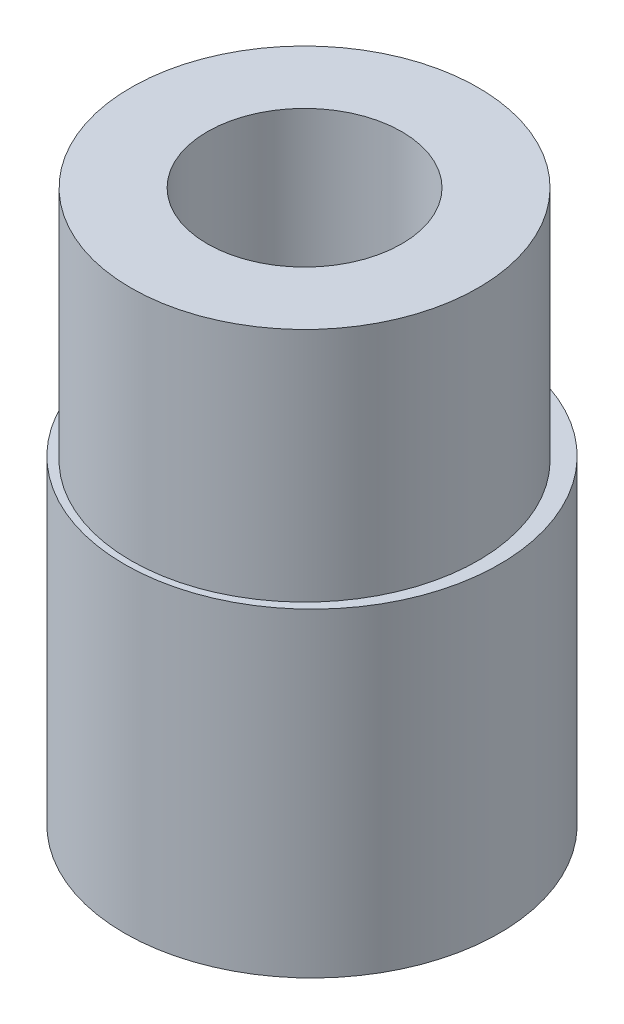
ISO-10303-21;
HEADER;
FILE_DESCRIPTION(('STEP AP214'),'2;1');
FILE_NAME('part.step','',(''),(''),'','','');
FILE_SCHEMA(('AUTOMOTIVE_DESIGN { 1 0 10303 214 1 1 1 1 }'));
ENDSEC;
DATA;
#1=APPLICATION_CONTEXT('core data for automotive mechanical design processes');
#2=APPLICATION_PROTOCOL_DEFINITION('international standard','automotive_design',2000,#1);
#3=PRODUCT_CONTEXT('',#1,'mechanical');
#4=PRODUCT('Part','Part','',(#3));
#5=PRODUCT_RELATED_PRODUCT_CATEGORY('part','',(#4));
#6=PRODUCT_DEFINITION_FORMATION('','',#4);
#7=PRODUCT_DEFINITION_CONTEXT('part definition',#1,'design');
#8=PRODUCT_DEFINITION('design','',#6,#7);
#9=PRODUCT_DEFINITION_SHAPE('','',#8);
#10=(LENGTH_UNIT() NAMED_UNIT(*) SI_UNIT(.MILLI.,.METRE.));
#11=(NAMED_UNIT(*) PLANE_ANGLE_UNIT() SI_UNIT($,.RADIAN.));
#12=(NAMED_UNIT(*) SI_UNIT($,.STERADIAN.) SOLID_ANGLE_UNIT());
#13=UNCERTAINTY_MEASURE_WITH_UNIT(LENGTH_MEASURE(1.E-05),#10,'distance_accuracy_value','');
#14=(GEOMETRIC_REPRESENTATION_CONTEXT(3) GLOBAL_UNCERTAINTY_ASSIGNED_CONTEXT((#13)) GLOBAL_UNIT_ASSIGNED_CONTEXT((#10,
#11,#12)) REPRESENTATION_CONTEXT('',''));
#15=CARTESIAN_POINT('',(0.,0.,0.));
#16=DIRECTION('',(0.,0.,1.));
#17=DIRECTION('',(1.,0.,0.));
#18=AXIS2_PLACEMENT_3D('',#15,#16,#17);
#19=CARTESIAN_POINT('',(0.,4.318,0.));
#20=DIRECTION('',(0.,-1.,0.));
#21=DIRECTION('',(0.,0.,-1.));
#22=AXIS2_PLACEMENT_3D('',#19,#20,#21);
#23=CYLINDRICAL_SURFACE('',#22,3.175);
#24=CARTESIAN_POINT('',(0.,4.318,0.));
#25=DIRECTION('',(0.,1.,0.));
#26=DIRECTION('',(0.,0.,1.));
#27=AXIS2_PLACEMENT_3D('',#24,#25,#26);
#28=CIRCLE('',#27,3.175);
#29=CARTESIAN_POINT('',(0.,4.318,3.175));
#30=VERTEX_POINT('',#29);
#31=EDGE_CURVE('E10',#30,#30,#28,.T.);
#32=ORIENTED_EDGE('',*,*,#31,.F.);
#33=EDGE_LOOP('',(#32));
#34=FACE_BOUND('',#33,.T.);
#35=CARTESIAN_POINT('',(0.,0.,0.));
#36=DIRECTION('',(0.,1.,0.));
#37=DIRECTION('',(0.,0.,1.));
#38=AXIS2_PLACEMENT_3D('',#35,#36,#37);
#39=CIRCLE('',#38,3.175);
#40=CARTESIAN_POINT('',(0.,0.,3.175));
#41=VERTEX_POINT('',#40);
#42=EDGE_CURVE('E38',#41,#41,#39,.T.);
#43=ORIENTED_EDGE('',*,*,#42,.T.);
#44=EDGE_LOOP('',(#43));
#45=FACE_BOUND('',#44,.T.);
#46=ADVANCED_FACE('F35',(#34,#45),#23,.T.);
#47=CARTESIAN_POINT('',(0.,4.318,0.));
#48=DIRECTION('',(0.,1.,0.));
#49=DIRECTION('',(0.,0.,1.));
#50=AXIS2_PLACEMENT_3D('',#47,#48,#49);
#51=PLANE('',#50);
#52=CARTESIAN_POINT('',(0.,4.318,0.));
#53=DIRECTION('',(0.,1.,0.));
#54=DIRECTION('',(0.,0.,1.));
#55=AXIS2_PLACEMENT_3D('',#52,#53,#54);
#56=CIRCLE('',#55,1.778);
#57=CARTESIAN_POINT('',(0.,4.318,1.778));
#58=VERTEX_POINT('',#57);
#59=EDGE_CURVE('E46',#58,#58,#56,.T.);
#60=ORIENTED_EDGE('',*,*,#59,.F.);
#61=EDGE_LOOP('',(#60));
#62=FACE_BOUND('',#61,.T.);
#63=ORIENTED_EDGE('',*,*,#31,.T.);
#64=EDGE_LOOP('',(#63));
#65=FACE_BOUND('',#64,.T.);
#66=ADVANCED_FACE('F93',(#62,#65),#51,.T.);
#67=CARTESIAN_POINT('',(0.,1.27,0.));
#68=DIRECTION('',(0.,1.,0.));
#69=DIRECTION('',(0.,0.,1.));
#70=AXIS2_PLACEMENT_3D('',#67,#68,#69);
#71=CYLINDRICAL_SURFACE('',#70,1.778);
#72=CARTESIAN_POINT('',(0.,1.27,0.));
#73=DIRECTION('',(0.,1.,0.));
#74=DIRECTION('',(0.,0.,1.));
#75=AXIS2_PLACEMENT_3D('',#72,#73,#74);
#76=CIRCLE('',#75,1.778);
#77=CARTESIAN_POINT('',(0.,1.27,1.778));
#78=VERTEX_POINT('',#77);
#79=EDGE_CURVE('E42',#78,#78,#76,.T.);
#80=CARTESIAN_POINT('',(0.,1.27,1.778));
#81=CARTESIAN_POINT('',(0.,1.30175,1.778));
#82=CARTESIAN_POINT('',(0.,1.3335,1.778));
#83=CARTESIAN_POINT('',(0.,1.397,1.778));
#84=CARTESIAN_POINT('',(0.,1.42875,1.778));
#85=CARTESIAN_POINT('',(0.,1.49225,1.778));
#86=CARTESIAN_POINT('',(0.,1.524,1.778));
#87=CARTESIAN_POINT('',(0.,1.5875,1.778));
#88=CARTESIAN_POINT('',(0.,1.61925,1.778));
#89=CARTESIAN_POINT('',(0.,1.68275,1.778));
#90=CARTESIAN_POINT('',(0.,1.7145,1.778));
#91=CARTESIAN_POINT('',(0.,1.778,1.778));
#92=CARTESIAN_POINT('',(0.,1.80975,1.778));
#93=CARTESIAN_POINT('',(0.,1.87325,1.778));
#94=CARTESIAN_POINT('',(0.,1.905,1.778));
#95=CARTESIAN_POINT('',(0.,1.9685,1.778));
#96=CARTESIAN_POINT('',(0.,2.00025,1.778));
#97=CARTESIAN_POINT('',(0.,2.06375,1.778));
#98=CARTESIAN_POINT('',(0.,2.0955,1.778));
#99=CARTESIAN_POINT('',(0.,2.159,1.778));
#100=CARTESIAN_POINT('',(0.,2.19075,1.778));
#101=CARTESIAN_POINT('',(0.,2.25425,1.778));
#102=CARTESIAN_POINT('',(0.,2.286,1.778));
#103=CARTESIAN_POINT('',(0.,2.3495,1.778));
#104=CARTESIAN_POINT('',(0.,2.38125,1.778));
#105=CARTESIAN_POINT('',(0.,2.44475,1.778));
#106=CARTESIAN_POINT('',(0.,2.4765,1.778));
#107=CARTESIAN_POINT('',(0.,2.54,1.778));
#108=CARTESIAN_POINT('',(0.,2.57175,1.778));
#109=CARTESIAN_POINT('',(0.,2.63525,1.778));
#110=CARTESIAN_POINT('',(0.,2.667,1.778));
#111=CARTESIAN_POINT('',(0.,2.7305,1.778));
#112=CARTESIAN_POINT('',(0.,2.76225,1.778));
#113=CARTESIAN_POINT('',(0.,2.82575,1.778));
#114=CARTESIAN_POINT('',(0.,2.8575,1.778));
#115=CARTESIAN_POINT('',(0.,2.921,1.778));
#116=CARTESIAN_POINT('',(0.,2.95275,1.778));
#117=CARTESIAN_POINT('',(0.,3.01625,1.778));
#118=CARTESIAN_POINT('',(0.,3.048,1.778));
#119=CARTESIAN_POINT('',(0.,3.1115,1.778));
#120=CARTESIAN_POINT('',(0.,3.14325,1.778));
#121=CARTESIAN_POINT('',(0.,3.20675,1.778));
#122=CARTESIAN_POINT('',(0.,3.2385,1.778));
#123=CARTESIAN_POINT('',(0.,3.302,1.778));
#124=CARTESIAN_POINT('',(0.,3.33375,1.778));
#125=CARTESIAN_POINT('',(0.,3.39725,1.778));
#126=CARTESIAN_POINT('',(0.,3.429,1.778));
#127=CARTESIAN_POINT('',(0.,3.4925,1.778));
#128=CARTESIAN_POINT('',(0.,3.52425,1.778));
#129=CARTESIAN_POINT('',(0.,3.58775,1.778));
#130=CARTESIAN_POINT('',(0.,3.6195,1.778));
#131=CARTESIAN_POINT('',(0.,3.683,1.778));
#132=CARTESIAN_POINT('',(0.,3.71475,1.778));
#133=CARTESIAN_POINT('',(0.,3.77825,1.778));
#134=CARTESIAN_POINT('',(0.,3.81,1.778));
#135=CARTESIAN_POINT('',(0.,3.8735,1.778));
#136=CARTESIAN_POINT('',(0.,3.90525,1.778));
#137=CARTESIAN_POINT('',(0.,3.96875,1.778));
#138=CARTESIAN_POINT('',(0.,4.0005,1.778));
#139=CARTESIAN_POINT('',(0.,4.064,1.778));
#140=CARTESIAN_POINT('',(0.,4.09575,1.778));
#141=CARTESIAN_POINT('',(0.,4.15925,1.778));
#142=CARTESIAN_POINT('',(0.,4.191,1.778));
#143=CARTESIAN_POINT('',(0.,4.2545,1.778));
#144=CARTESIAN_POINT('',(0.,4.28625,1.778));
#145=CARTESIAN_POINT('',(0.,4.318,1.778));
#146=B_SPLINE_CURVE_WITH_KNOTS('',3,(#80,#81,#82,#83,#84,#85,#86,#87,#88,#89,#90,#91,#92,#93,
#94,#95,#96,#97,#98,#99,#100,#101,#102,#103,#104,#105,#106,#107,#108,#109,#110,#111,#112,#113,
#114,#115,#116,#117,#118,#119,#120,#121,#122,#123,#124,#125,#126,#127,#128,#129,#130,#131,#132,
#133,#134,#135,#136,#137,#138,#139,#140,#141,#142,#143,#144,#145),.UNSPECIFIED.,.F.,.F.,(4,2,2,
2,2,2,2,2,2,2,2,2,2,2,2,2,2,2,2,2,2,2,2,2,2,2,2,2,2,2,2,2,4),(0.,0.0952500000000001,0.1905,
0.28575,0.381,0.47625,0.5715,0.66675,0.762,0.85725,0.9525,1.04775,1.143,1.23825,1.3335,1.42875,
1.524,1.61925,1.7145,1.80975,1.905,2.00025,2.0955,2.19075,2.286,2.38125,2.4765,2.57175,2.667,
2.76225,2.8575,2.95275,3.048),.UNSPECIFIED.);
#147=EDGE_CURVE('BSEAM98',#78,#58,#146,.T.);
#148=ORIENTED_EDGE('',*,*,#79,.F.);
#149=ORIENTED_EDGE('',*,*,#59,.T.);
#150=ORIENTED_EDGE('',*,*,#147,.T.);
#151=ORIENTED_EDGE('',*,*,#147,.F.);
#152=EDGE_LOOP('',(#148,#150,#149,#151));
#153=FACE_BOUND('',#152,.T.);
#154=ADVANCED_FACE('F98',(#153),#71,.F.);
#155=CARTESIAN_POINT('',(0.,1.27,0.));
#156=DIRECTION('',(0.,1.,0.));
#157=DIRECTION('',(0.,0.,1.));
#158=AXIS2_PLACEMENT_3D('',#155,#156,#157);
#159=PLANE('',#158);
#160=ORIENTED_EDGE('',*,*,#79,.T.);
#161=EDGE_LOOP('',(#160));
#162=FACE_BOUND('',#161,.T.);
#163=ADVANCED_FACE('F82',(#162),#159,.T.);
#164=CARTESIAN_POINT('',(0.,-5.842,-0.136069793768456));
#165=DIRECTION('',(0.,1.,0.));
#166=DIRECTION('',(0.,0.,1.));
#167=AXIS2_PLACEMENT_3D('',#164,#165,#166);
#168=CYLINDRICAL_SURFACE('',#167,3.429);
#169=CARTESIAN_POINT('',(0.,-5.842,-0.136069793768456));
#170=DIRECTION('',(0.,-1.,0.));
#171=DIRECTION('',(0.,0.,-1.));
#172=AXIS2_PLACEMENT_3D('',#169,#170,#171);
#173=CIRCLE('',#172,3.429);
#174=CARTESIAN_POINT('',(0.,-5.842,-3.56506979376846));
#175=VERTEX_POINT('',#174);
#176=EDGE_CURVE('E54',#175,#175,#173,.T.);
#177=ORIENTED_EDGE('',*,*,#176,.F.);
#178=EDGE_LOOP('',(#177));
#179=FACE_BOUND('',#178,.T.);
#180=CARTESIAN_POINT('',(0.,0.,-0.136069793768456));
#181=DIRECTION('',(0.,-1.,0.));
#182=DIRECTION('',(0.,0.,-1.));
#183=AXIS2_PLACEMENT_3D('',#180,#181,#182);
#184=CIRCLE('',#183,3.429);
#185=CARTESIAN_POINT('',(0.,0.,-3.56506979376846));
#186=VERTEX_POINT('',#185);
#187=EDGE_CURVE('E51',#186,#186,#184,.T.);
#188=ORIENTED_EDGE('',*,*,#187,.T.);
#189=EDGE_LOOP('',(#188));
#190=FACE_BOUND('',#189,.T.);
#191=ADVANCED_FACE('F76',(#179,#190),#168,.T.);
#192=CARTESIAN_POINT('',(0.,-5.842,-0.136069793768456));
#193=DIRECTION('',(0.,-1.,0.));
#194=DIRECTION('',(0.,0.,-1.));
#195=AXIS2_PLACEMENT_3D('',#192,#193,#194);
#196=PLANE('',#195);
#197=CARTESIAN_POINT('',(0.,-5.842,0.));
#198=DIRECTION('',(0.,-1.,0.));
#199=DIRECTION('',(0.,0.,-1.));
#200=AXIS2_PLACEMENT_3D('',#197,#198,#199);
#201=CIRCLE('',#200,2.794);
#202=CARTESIAN_POINT('',(0.,-5.842,-2.794));
#203=VERTEX_POINT('',#202);
#204=EDGE_CURVE('E58',#203,#203,#201,.T.);
#205=ORIENTED_EDGE('',*,*,#204,.F.);
#206=EDGE_LOOP('',(#205));
#207=FACE_BOUND('',#206,.T.);
#208=ORIENTED_EDGE('',*,*,#176,.T.);
#209=EDGE_LOOP('',(#208));
#210=FACE_BOUND('',#209,.T.);
#211=ADVANCED_FACE('F73',(#207,#210),#196,.T.);
#212=CARTESIAN_POINT('',(0.,0.,-0.136069793768456));
#213=DIRECTION('',(0.,-1.,0.));
#214=DIRECTION('',(0.,0.,-1.));
#215=AXIS2_PLACEMENT_3D('',#212,#213,#214);
#216=PLANE('',#215);
#217=ORIENTED_EDGE('',*,*,#42,.F.);
#218=EDGE_LOOP('',(#217));
#219=FACE_BOUND('',#218,.T.);
#220=ORIENTED_EDGE('',*,*,#187,.F.);
#221=EDGE_LOOP('',(#220));
#222=FACE_BOUND('',#221,.T.);
#223=ADVANCED_FACE('F69',(#219,#222),#216,.F.);
#224=CARTESIAN_POINT('',(0.,-1.016,0.));
#225=DIRECTION('',(0.,-1.,0.));
#226=DIRECTION('',(0.,0.,-1.));
#227=AXIS2_PLACEMENT_3D('',#224,#225,#226);
#228=CYLINDRICAL_SURFACE('',#227,2.794);
#229=CARTESIAN_POINT('',(0.,-1.016,0.));
#230=DIRECTION('',(0.,-1.,0.));
#231=DIRECTION('',(0.,0.,-1.));
#232=AXIS2_PLACEMENT_3D('',#229,#230,#231);
#233=CIRCLE('',#232,2.794);
#234=CARTESIAN_POINT('',(0.,-1.016,-2.794));
#235=VERTEX_POINT('',#234);
#236=EDGE_CURVE('E55',#235,#235,#233,.T.);
#237=ORIENTED_EDGE('',*,*,#236,.F.);
#238=EDGE_LOOP('',(#237));
#239=FACE_BOUND('',#238,.T.);
#240=ORIENTED_EDGE('',*,*,#204,.T.);
#241=EDGE_LOOP('',(#240));
#242=FACE_BOUND('',#241,.T.);
#243=ADVANCED_FACE('F66',(#239,#242),#228,.F.);
#244=CARTESIAN_POINT('',(0.,-1.016,0.));
#245=DIRECTION('',(0.,-1.,0.));
#246=DIRECTION('',(0.,0.,-1.));
#247=AXIS2_PLACEMENT_3D('',#244,#245,#246);
#248=PLANE('',#247);
#249=ORIENTED_EDGE('',*,*,#236,.T.);
#250=EDGE_LOOP('',(#249));
#251=FACE_BOUND('',#250,.T.);
#252=ADVANCED_FACE('F64',(#251),#248,.T.);
#253=CLOSED_SHELL('',(#46,#66,#154,#163,#191,#211,#223,#243,#252));
#254=MANIFOLD_SOLID_BREP('B2',#253);
#255=ADVANCED_BREP_SHAPE_REPRESENTATION('',(#18,#254),#14);
#256=SHAPE_DEFINITION_REPRESENTATION(#9,#255);
ENDSEC;
END-ISO-10303-21;
